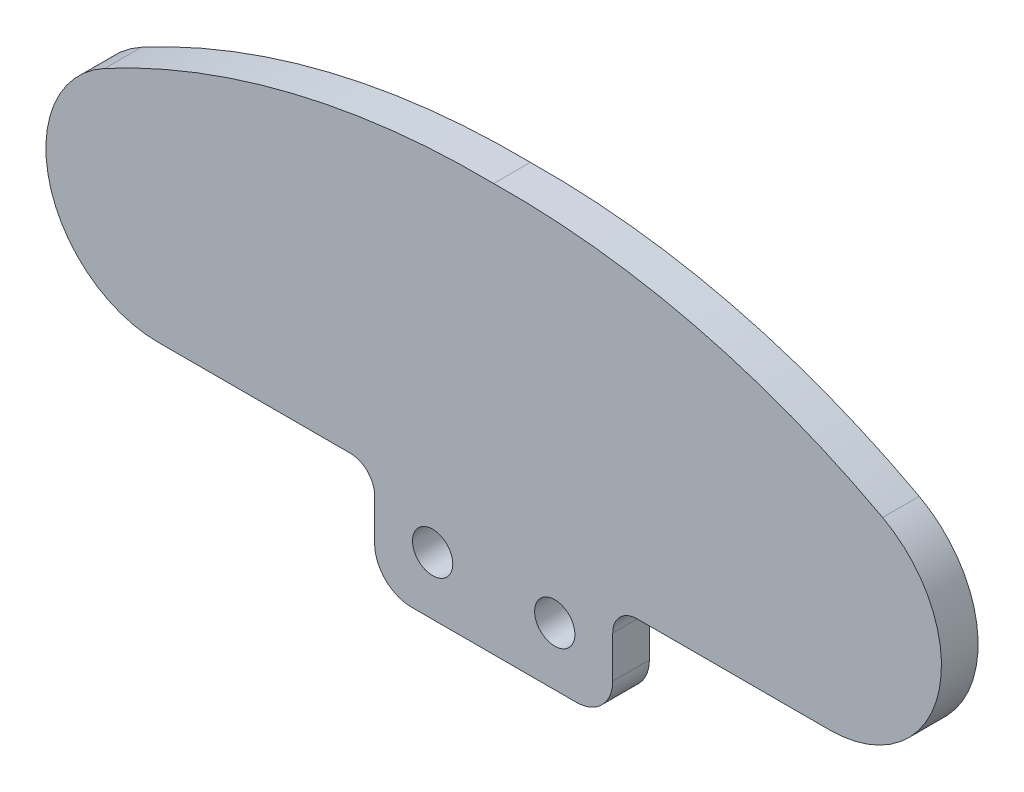
ISO-10303-21;
HEADER;
FILE_DESCRIPTION(('STEP AP214'),'2;1');
FILE_NAME('part.step','',(''),(''),'','','');
FILE_SCHEMA(('AUTOMOTIVE_DESIGN { 1 0 10303 214 1 1 1 1 }'));
ENDSEC;
DATA;
#1=APPLICATION_CONTEXT('core data for automotive mechanical design processes');
#2=APPLICATION_PROTOCOL_DEFINITION('international standard','automotive_design',2000,#1);
#3=PRODUCT_CONTEXT('',#1,'mechanical');
#4=PRODUCT('Part','Part','',(#3));
#5=PRODUCT_RELATED_PRODUCT_CATEGORY('part','',(#4));
#6=PRODUCT_DEFINITION_FORMATION('','',#4);
#7=PRODUCT_DEFINITION_CONTEXT('part definition',#1,'design');
#8=PRODUCT_DEFINITION('design','',#6,#7);
#9=PRODUCT_DEFINITION_SHAPE('','',#8);
#10=(LENGTH_UNIT() NAMED_UNIT(*) SI_UNIT(.MILLI.,.METRE.));
#11=(NAMED_UNIT(*) PLANE_ANGLE_UNIT() SI_UNIT($,.RADIAN.));
#12=(NAMED_UNIT(*) SI_UNIT($,.STERADIAN.) SOLID_ANGLE_UNIT());
#13=UNCERTAINTY_MEASURE_WITH_UNIT(LENGTH_MEASURE(1.E-05),#10,'distance_accuracy_value','');
#14=(GEOMETRIC_REPRESENTATION_CONTEXT(3) GLOBAL_UNCERTAINTY_ASSIGNED_CONTEXT((#13)) GLOBAL_UNIT_ASSIGNED_CONTEXT((#10,
#11,#12)) REPRESENTATION_CONTEXT('',''));
#15=CARTESIAN_POINT('',(0.,0.,0.));
#16=DIRECTION('',(0.,0.,1.));
#17=DIRECTION('',(1.,0.,0.));
#18=AXIS2_PLACEMENT_3D('',#15,#16,#17);
#19=CARTESIAN_POINT('',(175.25,592.824163383124,3.));
#20=DIRECTION('',(0.,0.,-1.));
#21=DIRECTION('',(-1.,0.,0.));
#22=AXIS2_PLACEMENT_3D('',#19,#20,#21);
#23=CYLINDRICAL_SURFACE('',#22,9.16791338312348);
#24=CARTESIAN_POINT('',(175.25,592.824163383124,0.));
#25=DIRECTION('',(0.,0.,1.));
#26=DIRECTION('',(1.,0.,0.));
#27=AXIS2_PLACEMENT_3D('',#24,#25,#26);
#28=CIRCLE('',#27,9.16791338312348);
#29=CARTESIAN_POINT('',(175.25,583.65625,0.));
#30=VERTEX_POINT('',#29);
#31=CARTESIAN_POINT('',(179.599043891456,600.894879152536,0.));
#32=VERTEX_POINT('',#31);
#33=EDGE_CURVE('E193',#30,#32,#28,.T.);
#34=ORIENTED_EDGE('',*,*,#33,.T.);
#35=DIRECTION('',(0.,0.,-1.));
#36=VECTOR('',#35,1.);
#37=CARTESIAN_POINT('',(179.599043891456,600.894879152536,3.));
#38=LINE('',#37,#36);
#39=CARTESIAN_POINT('',(179.599043891456,600.894879152536,3.));
#40=VERTEX_POINT('',#39);
#41=EDGE_CURVE('E135',#40,#32,#38,.T.);
#42=ORIENTED_EDGE('',*,*,#41,.F.);
#43=CARTESIAN_POINT('',(175.25,592.824163383124,3.));
#44=DIRECTION('',(0.,0.,1.));
#45=DIRECTION('',(1.,0.,0.));
#46=AXIS2_PLACEMENT_3D('',#43,#44,#45);
#47=CIRCLE('',#46,9.16791338312348);
#48=CARTESIAN_POINT('',(175.25,583.65625,3.));
#49=VERTEX_POINT('',#48);
#50=EDGE_CURVE('E122',#49,#40,#47,.T.);
#51=ORIENTED_EDGE('',*,*,#50,.F.);
#52=DIRECTION('',(0.,0.,-1.));
#53=VECTOR('',#52,1.);
#54=CARTESIAN_POINT('',(175.25,583.65625,3.));
#55=LINE('',#54,#53);
#56=EDGE_CURVE('E163',#49,#30,#55,.T.);
#57=ORIENTED_EDGE('',*,*,#56,.T.);
#58=EDGE_LOOP('',(#34,#42,#51,#57));
#59=FACE_BOUND('',#58,.T.);
#60=ADVANCED_FACE('F17',(#59),#23,.T.);
#61=CARTESIAN_POINT('',(148.800998393416,543.741565074368,3.));
#62=DIRECTION('',(0.,0.,-1.));
#63=DIRECTION('',(-1.,0.,0.));
#64=AXIS2_PLACEMENT_3D('',#61,#62,#63);
#65=CYLINDRICAL_SURFACE('',#64,64.9231924401213);
#66=CARTESIAN_POINT('',(148.800998393416,543.741565074368,0.));
#67=DIRECTION('',(0.,0.,1.));
#68=DIRECTION('',(1.,0.,0.));
#69=AXIS2_PLACEMENT_3D('',#66,#67,#68);
#70=CIRCLE('',#69,64.9231924401213);
#71=CARTESIAN_POINT('',(147.75,608.65625,0.));
#72=VERTEX_POINT('',#71);
#73=EDGE_CURVE('E132',#32,#72,#70,.T.);
#74=ORIENTED_EDGE('',*,*,#73,.T.);
#75=DIRECTION('',(0.,0.,-1.));
#76=VECTOR('',#75,1.);
#77=CARTESIAN_POINT('',(147.75,608.65625,3.));
#78=LINE('',#77,#76);
#79=CARTESIAN_POINT('',(147.75,608.65625,3.));
#80=VERTEX_POINT('',#79);
#81=EDGE_CURVE('E130',#80,#72,#78,.T.);
#82=ORIENTED_EDGE('',*,*,#81,.F.);
#83=CARTESIAN_POINT('',(148.800998393416,543.741565074368,3.));
#84=DIRECTION('',(0.,0.,1.));
#85=DIRECTION('',(1.,0.,0.));
#86=AXIS2_PLACEMENT_3D('',#83,#84,#85);
#87=CIRCLE('',#86,64.9231924401213);
#88=EDGE_CURVE('E111',#40,#80,#87,.T.);
#89=ORIENTED_EDGE('',*,*,#88,.F.);
#90=ORIENTED_EDGE('',*,*,#41,.T.);
#91=EDGE_LOOP('',(#74,#82,#89,#90));
#92=FACE_BOUND('',#91,.T.);
#93=ADVANCED_FACE('F131',(#92),#65,.T.);
#94=CARTESIAN_POINT('',(146.699001606584,543.741565074369,3.));
#95=DIRECTION('',(0.,0.,-1.));
#96=DIRECTION('',(-1.,0.,0.));
#97=AXIS2_PLACEMENT_3D('',#94,#95,#96);
#98=CYLINDRICAL_SURFACE('',#97,64.9231924401209);
#99=CARTESIAN_POINT('',(146.699001606584,543.741565074369,0.));
#100=DIRECTION('',(0.,0.,1.));
#101=DIRECTION('',(1.,0.,0.));
#102=AXIS2_PLACEMENT_3D('',#99,#100,#101);
#103=CIRCLE('',#102,64.9231924401209);
#104=CARTESIAN_POINT('',(115.900956108544,600.894879152536,0.));
#105=VERTEX_POINT('',#104);
#106=EDGE_CURVE('E183',#72,#105,#103,.T.);
#107=ORIENTED_EDGE('',*,*,#106,.T.);
#108=DIRECTION('',(0.,0.,-1.));
#109=VECTOR('',#108,1.);
#110=CARTESIAN_POINT('',(115.900956108544,600.894879152536,3.));
#111=LINE('',#110,#109);
#112=CARTESIAN_POINT('',(115.900956108544,600.894879152536,3.));
#113=VERTEX_POINT('',#112);
#114=EDGE_CURVE('E136',#113,#105,#111,.T.);
#115=ORIENTED_EDGE('',*,*,#114,.F.);
#116=CARTESIAN_POINT('',(146.699001606584,543.741565074369,3.));
#117=DIRECTION('',(0.,0.,1.));
#118=DIRECTION('',(1.,0.,0.));
#119=AXIS2_PLACEMENT_3D('',#116,#117,#118);
#120=CIRCLE('',#119,64.9231924401209);
#121=EDGE_CURVE('E118',#80,#113,#120,.T.);
#122=ORIENTED_EDGE('',*,*,#121,.F.);
#123=ORIENTED_EDGE('',*,*,#81,.T.);
#124=EDGE_LOOP('',(#107,#115,#122,#123));
#125=FACE_BOUND('',#124,.T.);
#126=ADVANCED_FACE('F138',(#125),#98,.T.);
#127=CARTESIAN_POINT('',(120.25,592.824163383124,3.));
#128=DIRECTION('',(0.,0.,-1.));
#129=DIRECTION('',(-1.,0.,0.));
#130=AXIS2_PLACEMENT_3D('',#127,#128,#129);
#131=CYLINDRICAL_SURFACE('',#130,9.16791338312351);
#132=CARTESIAN_POINT('',(120.25,592.824163383124,0.));
#133=DIRECTION('',(0.,0.,1.));
#134=DIRECTION('',(1.,0.,0.));
#135=AXIS2_PLACEMENT_3D('',#132,#133,#134);
#136=CIRCLE('',#135,9.16791338312351);
#137=CARTESIAN_POINT('',(120.25,583.65625,0.));
#138=VERTEX_POINT('',#137);
#139=EDGE_CURVE('E186',#105,#138,#136,.T.);
#140=ORIENTED_EDGE('',*,*,#139,.T.);
#141=DIRECTION('',(0.,0.,-1.));
#142=VECTOR('',#141,1.);
#143=CARTESIAN_POINT('',(120.25,583.65625,3.));
#144=LINE('',#143,#142);
#145=CARTESIAN_POINT('',(120.25,583.65625,3.));
#146=VERTEX_POINT('',#145);
#147=EDGE_CURVE('E204',#146,#138,#144,.T.);
#148=ORIENTED_EDGE('',*,*,#147,.F.);
#149=CARTESIAN_POINT('',(120.25,592.824163383124,3.));
#150=DIRECTION('',(0.,0.,1.));
#151=DIRECTION('',(1.,0.,0.));
#152=AXIS2_PLACEMENT_3D('',#149,#150,#151);
#153=CIRCLE('',#152,9.16791338312351);
#154=EDGE_CURVE('E142',#113,#146,#153,.T.);
#155=ORIENTED_EDGE('',*,*,#154,.F.);
#156=ORIENTED_EDGE('',*,*,#114,.T.);
#157=EDGE_LOOP('',(#140,#148,#155,#156));
#158=FACE_BOUND('',#157,.T.);
#159=ADVANCED_FACE('F263',(#158),#131,.T.);
#160=CARTESIAN_POINT('',(129.125,583.65625,3.));
#161=DIRECTION('',(0.,-1.,0.));
#162=DIRECTION('',(1.,0.,0.));
#163=AXIS2_PLACEMENT_3D('',#160,#161,#162);
#164=PLANE('',#163);
#165=DIRECTION('',(-1.,0.,0.));
#166=VECTOR('',#165,1.);
#167=CARTESIAN_POINT('',(129.125,583.65625,0.));
#168=LINE('',#167,#166);
#169=CARTESIAN_POINT('',(136.,583.65625,0.));
#170=VERTEX_POINT('',#169);
#171=EDGE_CURVE('E190',#170,#138,#168,.T.);
#172=ORIENTED_EDGE('',*,*,#171,.F.);
#173=DIRECTION('',(0.,0.,-1.));
#174=VECTOR('',#173,1.);
#175=CARTESIAN_POINT('',(136.,583.65625,3.));
#176=LINE('',#175,#174);
#177=CARTESIAN_POINT('',(136.,583.65625,3.));
#178=VERTEX_POINT('',#177);
#179=EDGE_CURVE('E230',#170,#178,#176,.F.);
#180=ORIENTED_EDGE('',*,*,#179,.T.);
#181=DIRECTION('',(-1.,0.,0.));
#182=VECTOR('',#181,1.);
#183=CARTESIAN_POINT('',(129.125,583.65625,3.));
#184=LINE('',#183,#182);
#185=EDGE_CURVE('E149',#178,#146,#184,.T.);
#186=ORIENTED_EDGE('',*,*,#185,.T.);
#187=ORIENTED_EDGE('',*,*,#147,.T.);
#188=EDGE_LOOP('',(#172,#180,#186,#187));
#189=FACE_BOUND('',#188,.T.);
#190=ADVANCED_FACE('F260',(#189),#164,.T.);
#191=CARTESIAN_POINT('',(138.,579.45068782568,3.));
#192=DIRECTION('',(-1.,0.,0.));
#193=DIRECTION('',(0.,0.,1.));
#194=AXIS2_PLACEMENT_3D('',#191,#192,#193);
#195=PLANE('',#194);
#196=DIRECTION('',(0.,1.,0.));
#197=VECTOR('',#196,1.);
#198=CARTESIAN_POINT('',(138.,579.45068782568,3.));
#199=LINE('',#198,#197);
#200=CARTESIAN_POINT('',(138.,578.24512565136,3.));
#201=VERTEX_POINT('',#200);
#202=CARTESIAN_POINT('',(138.,581.65625,3.));
#203=VERTEX_POINT('',#202);
#204=EDGE_CURVE('E202',#201,#203,#199,.T.);
#205=ORIENTED_EDGE('',*,*,#204,.T.);
#206=DIRECTION('',(0.,0.,-1.));
#207=VECTOR('',#206,1.);
#208=CARTESIAN_POINT('',(138.,581.65625,0.));
#209=LINE('',#208,#207);
#210=CARTESIAN_POINT('',(138.,581.65625,0.));
#211=VERTEX_POINT('',#210);
#212=EDGE_CURVE('E227',#203,#211,#209,.T.);
#213=ORIENTED_EDGE('',*,*,#212,.T.);
#214=DIRECTION('',(0.,1.,0.));
#215=VECTOR('',#214,1.);
#216=CARTESIAN_POINT('',(138.,579.45068782568,0.));
#217=LINE('',#216,#215);
#218=CARTESIAN_POINT('',(138.,578.24512565136,0.));
#219=VERTEX_POINT('',#218);
#220=EDGE_CURVE('E164',#219,#211,#217,.T.);
#221=ORIENTED_EDGE('',*,*,#220,.F.);
#222=DIRECTION('',(0.,0.,-1.));
#223=VECTOR('',#222,1.);
#224=CARTESIAN_POINT('',(138.,578.24512565136,3.));
#225=LINE('',#224,#223);
#226=EDGE_CURVE('E218',#219,#201,#225,.F.);
#227=ORIENTED_EDGE('',*,*,#226,.T.);
#228=EDGE_LOOP('',(#205,#213,#221,#227));
#229=FACE_BOUND('',#228,.T.);
#230=ADVANCED_FACE('F247',(#229),#195,.T.);
#231=CARTESIAN_POINT('',(147.75,575.24512565136,3.));
#232=DIRECTION('',(0.,1.,0.));
#233=DIRECTION('',(0.,0.,1.));
#234=AXIS2_PLACEMENT_3D('',#231,#232,#233);
#235=PLANE('',#234);
#236=DIRECTION('',(1.,0.,0.));
#237=VECTOR('',#236,1.);
#238=CARTESIAN_POINT('',(147.75,575.24512565136,3.));
#239=LINE('',#238,#237);
#240=CARTESIAN_POINT('',(141.,575.24512565136,3.));
#241=VERTEX_POINT('',#240);
#242=CARTESIAN_POINT('',(154.5,575.24512565136,3.));
#243=VERTEX_POINT('',#242);
#244=EDGE_CURVE('E251',#241,#243,#239,.T.);
#245=ORIENTED_EDGE('',*,*,#244,.F.);
#246=DIRECTION('',(0.,0.,-1.));
#247=VECTOR('',#246,1.);
#248=CARTESIAN_POINT('',(141.,575.24512565136,0.));
#249=LINE('',#248,#247);
#250=CARTESIAN_POINT('',(141.,575.24512565136,0.));
#251=VERTEX_POINT('',#250);
#252=EDGE_CURVE('E211',#241,#251,#249,.T.);
#253=ORIENTED_EDGE('',*,*,#252,.T.);
#254=DIRECTION('',(1.,0.,0.));
#255=VECTOR('',#254,1.);
#256=CARTESIAN_POINT('',(147.75,575.24512565136,0.));
#257=LINE('',#256,#255);
#258=CARTESIAN_POINT('',(154.5,575.24512565136,0.));
#259=VERTEX_POINT('',#258);
#260=EDGE_CURVE('E168',#251,#259,#257,.T.);
#261=ORIENTED_EDGE('',*,*,#260,.T.);
#262=DIRECTION('',(0.,0.,-1.));
#263=VECTOR('',#262,1.);
#264=CARTESIAN_POINT('',(154.5,575.24512565136,3.));
#265=LINE('',#264,#263);
#266=EDGE_CURVE('E206',#259,#243,#265,.F.);
#267=ORIENTED_EDGE('',*,*,#266,.T.);
#268=EDGE_LOOP('',(#245,#253,#261,#267));
#269=FACE_BOUND('',#268,.T.);
#270=ADVANCED_FACE('F292',(#269),#235,.F.);
#271=CARTESIAN_POINT('',(157.5,579.45068782568,3.));
#272=DIRECTION('',(-1.,0.,0.));
#273=DIRECTION('',(0.,0.,1.));
#274=AXIS2_PLACEMENT_3D('',#271,#272,#273);
#275=PLANE('',#274);
#276=DIRECTION('',(0.,1.,0.));
#277=VECTOR('',#276,1.);
#278=CARTESIAN_POINT('',(157.5,579.45068782568,0.));
#279=LINE('',#278,#277);
#280=CARTESIAN_POINT('',(157.5,578.24512565136,0.));
#281=VERTEX_POINT('',#280);
#282=CARTESIAN_POINT('',(157.5,581.65625,0.));
#283=VERTEX_POINT('',#282);
#284=EDGE_CURVE('E172',#281,#283,#279,.T.);
#285=ORIENTED_EDGE('',*,*,#284,.T.);
#286=DIRECTION('',(0.,0.,-1.));
#287=VECTOR('',#286,1.);
#288=CARTESIAN_POINT('',(157.5,581.65625,3.));
#289=LINE('',#288,#287);
#290=CARTESIAN_POINT('',(157.5,581.65625,3.));
#291=VERTEX_POINT('',#290);
#292=EDGE_CURVE('E38',#283,#291,#289,.F.);
#293=ORIENTED_EDGE('',*,*,#292,.T.);
#294=DIRECTION('',(0.,1.,0.));
#295=VECTOR('',#294,1.);
#296=CARTESIAN_POINT('',(157.5,579.45068782568,3.));
#297=LINE('',#296,#295);
#298=CARTESIAN_POINT('',(157.5,578.24512565136,3.));
#299=VERTEX_POINT('',#298);
#300=EDGE_CURVE('E272',#299,#291,#297,.T.);
#301=ORIENTED_EDGE('',*,*,#300,.F.);
#302=DIRECTION('',(0.,0.,-1.));
#303=VECTOR('',#302,1.);
#304=CARTESIAN_POINT('',(157.5,578.24512565136,3.));
#305=LINE('',#304,#303);
#306=EDGE_CURVE('E224',#299,#281,#305,.T.);
#307=ORIENTED_EDGE('',*,*,#306,.T.);
#308=EDGE_LOOP('',(#285,#293,#301,#307));
#309=FACE_BOUND('',#308,.T.);
#310=ADVANCED_FACE('F291',(#309),#275,.F.);
#311=CARTESIAN_POINT('',(142.75,579.99512565136,3.));
#312=DIRECTION('',(0.,0.,-1.));
#313=DIRECTION('',(-1.,0.,0.));
#314=AXIS2_PLACEMENT_3D('',#311,#312,#313);
#315=CYLINDRICAL_SURFACE('',#314,1.65);
#316=CARTESIAN_POINT('',(142.75,579.99512565136,3.));
#317=DIRECTION('',(0.,0.,1.));
#318=DIRECTION('',(1.,0.,0.));
#319=AXIS2_PLACEMENT_3D('',#316,#317,#318);
#320=CIRCLE('',#319,1.65);
#321=CARTESIAN_POINT('',(144.4,579.99512565136,3.));
#322=VERTEX_POINT('',#321);
#323=EDGE_CURVE('E152',#322,#322,#320,.T.);
#324=ORIENTED_EDGE('',*,*,#323,.T.);
#325=EDGE_LOOP('',(#324));
#326=FACE_BOUND('',#325,.T.);
#327=CARTESIAN_POINT('',(142.75,579.99512565136,0.));
#328=DIRECTION('',(0.,0.,1.));
#329=DIRECTION('',(1.,0.,0.));
#330=AXIS2_PLACEMENT_3D('',#327,#328,#329);
#331=CIRCLE('',#330,1.65);
#332=CARTESIAN_POINT('',(144.4,579.99512565136,0.));
#333=VERTEX_POINT('',#332);
#334=EDGE_CURVE('E175',#333,#333,#331,.T.);
#335=ORIENTED_EDGE('',*,*,#334,.F.);
#336=EDGE_LOOP('',(#335));
#337=FACE_BOUND('',#336,.T.);
#338=ADVANCED_FACE('F325',(#326,#337),#315,.F.);
#339=CARTESIAN_POINT('',(147.75,583.65625,3.));
#340=DIRECTION('',(0.,-1.,0.));
#341=DIRECTION('',(0.,0.,-1.));
#342=AXIS2_PLACEMENT_3D('',#339,#340,#341);
#343=PLANE('',#342);
#344=DIRECTION('',(-1.,0.,0.));
#345=VECTOR('',#344,1.);
#346=CARTESIAN_POINT('',(147.75,583.65625,3.));
#347=LINE('',#346,#345);
#348=CARTESIAN_POINT('',(159.5,583.65625,3.));
#349=VERTEX_POINT('',#348);
#350=EDGE_CURVE('E127',#49,#349,#347,.T.);
#351=ORIENTED_EDGE('',*,*,#350,.T.);
#352=DIRECTION('',(0.,0.,-1.));
#353=VECTOR('',#352,1.);
#354=CARTESIAN_POINT('',(159.5,583.65625,3.));
#355=LINE('',#354,#353);
#356=CARTESIAN_POINT('',(159.5,583.65625,0.));
#357=VERTEX_POINT('',#356);
#358=EDGE_CURVE('E232',#349,#357,#355,.T.);
#359=ORIENTED_EDGE('',*,*,#358,.T.);
#360=DIRECTION('',(-1.,0.,0.));
#361=VECTOR('',#360,1.);
#362=CARTESIAN_POINT('',(147.75,583.65625,0.));
#363=LINE('',#362,#361);
#364=EDGE_CURVE('E199',#30,#357,#363,.T.);
#365=ORIENTED_EDGE('',*,*,#364,.F.);
#366=ORIENTED_EDGE('',*,*,#56,.F.);
#367=EDGE_LOOP('',(#351,#359,#365,#366));
#368=FACE_BOUND('',#367,.T.);
#369=ADVANCED_FACE('F268',(#368),#343,.T.);
#370=CARTESIAN_POINT('',(152.75,579.99512565136,3.));
#371=DIRECTION('',(0.,0.,-1.));
#372=DIRECTION('',(-1.,0.,0.));
#373=AXIS2_PLACEMENT_3D('',#370,#371,#372);
#374=CYLINDRICAL_SURFACE('',#373,1.65);
#375=CARTESIAN_POINT('',(152.75,579.99512565136,3.));
#376=DIRECTION('',(0.,0.,1.));
#377=DIRECTION('',(1.,0.,0.));
#378=AXIS2_PLACEMENT_3D('',#375,#376,#377);
#379=CIRCLE('',#378,1.65);
#380=CARTESIAN_POINT('',(154.4,579.99512565136,3.));
#381=VERTEX_POINT('',#380);
#382=EDGE_CURVE('E143',#381,#381,#379,.T.);
#383=ORIENTED_EDGE('',*,*,#382,.T.);
#384=EDGE_LOOP('',(#383));
#385=FACE_BOUND('',#384,.T.);
#386=CARTESIAN_POINT('',(152.75,579.99512565136,0.));
#387=DIRECTION('',(0.,0.,1.));
#388=DIRECTION('',(1.,0.,0.));
#389=AXIS2_PLACEMENT_3D('',#386,#387,#388);
#390=CIRCLE('',#389,1.65);
#391=CARTESIAN_POINT('',(154.4,579.99512565136,0.));
#392=VERTEX_POINT('',#391);
#393=EDGE_CURVE('E179',#392,#392,#390,.T.);
#394=ORIENTED_EDGE('',*,*,#393,.F.);
#395=EDGE_LOOP('',(#394));
#396=FACE_BOUND('',#395,.T.);
#397=ADVANCED_FACE('F321',(#385,#396),#374,.F.);
#398=CARTESIAN_POINT('',(56.,361.,3.));
#399=DIRECTION('',(0.,0.,1.));
#400=DIRECTION('',(1.,0.,0.));
#401=AXIS2_PLACEMENT_3D('',#398,#399,#400);
#402=PLANE('',#401);
#403=ORIENTED_EDGE('',*,*,#204,.F.);
#404=CARTESIAN_POINT('',(141.,578.24512565136,3.));
#405=DIRECTION('',(0.,0.,1.));
#406=DIRECTION('',(1.,0.,0.));
#407=AXIS2_PLACEMENT_3D('',#404,#405,#406);
#408=CIRCLE('',#407,3.);
#409=EDGE_CURVE('E222',#201,#241,#408,.T.);
#410=ORIENTED_EDGE('',*,*,#409,.T.);
#411=ORIENTED_EDGE('',*,*,#244,.T.);
#412=CARTESIAN_POINT('',(154.5,578.24512565136,3.));
#413=DIRECTION('',(0.,0.,1.));
#414=DIRECTION('',(1.,0.,0.));
#415=AXIS2_PLACEMENT_3D('',#412,#413,#414);
#416=CIRCLE('',#415,3.);
#417=EDGE_CURVE('E220',#243,#299,#416,.T.);
#418=ORIENTED_EDGE('',*,*,#417,.T.);
#419=ORIENTED_EDGE('',*,*,#300,.T.);
#420=CARTESIAN_POINT('',(159.5,581.65625,3.));
#421=DIRECTION('',(0.,0.,1.));
#422=DIRECTION('',(1.,0.,0.));
#423=AXIS2_PLACEMENT_3D('',#420,#421,#422);
#424=CIRCLE('',#423,2.);
#425=EDGE_CURVE('E11',#291,#349,#424,.F.);
#426=ORIENTED_EDGE('',*,*,#425,.T.);
#427=ORIENTED_EDGE('',*,*,#350,.F.);
#428=ORIENTED_EDGE('',*,*,#50,.T.);
#429=ORIENTED_EDGE('',*,*,#88,.T.);
#430=ORIENTED_EDGE('',*,*,#121,.T.);
#431=ORIENTED_EDGE('',*,*,#154,.T.);
#432=ORIENTED_EDGE('',*,*,#185,.F.);
#433=CARTESIAN_POINT('',(136.,581.65625,3.));
#434=DIRECTION('',(0.,0.,1.));
#435=DIRECTION('',(1.,0.,0.));
#436=AXIS2_PLACEMENT_3D('',#433,#434,#435);
#437=CIRCLE('',#436,2.);
#438=EDGE_CURVE('E238',#178,#203,#437,.F.);
#439=ORIENTED_EDGE('',*,*,#438,.T.);
#440=EDGE_LOOP('',(#403,#410,#411,#418,#419,#426,#427,#428,#429,#430,#431,#432,#439));
#441=FACE_BOUND('',#440,.T.);
#442=ORIENTED_EDGE('',*,*,#323,.F.);
#443=EDGE_LOOP('',(#442));
#444=FACE_BOUND('',#443,.T.);
#445=ORIENTED_EDGE('',*,*,#382,.F.);
#446=EDGE_LOOP('',(#445));
#447=FACE_BOUND('',#446,.T.);
#448=ADVANCED_FACE('F114',(#441,#444,#447),#402,.T.);
#449=CARTESIAN_POINT('',(56.,361.,0.));
#450=DIRECTION('',(0.,0.,1.));
#451=DIRECTION('',(1.,0.,0.));
#452=AXIS2_PLACEMENT_3D('',#449,#450,#451);
#453=PLANE('',#452);
#454=ORIENTED_EDGE('',*,*,#260,.F.);
#455=CARTESIAN_POINT('',(141.,578.24512565136,0.));
#456=DIRECTION('',(0.,0.,1.));
#457=DIRECTION('',(1.,0.,0.));
#458=AXIS2_PLACEMENT_3D('',#455,#456,#457);
#459=CIRCLE('',#458,3.);
#460=EDGE_CURVE('E216',#251,#219,#459,.F.);
#461=ORIENTED_EDGE('',*,*,#460,.T.);
#462=ORIENTED_EDGE('',*,*,#220,.T.);
#463=CARTESIAN_POINT('',(136.,581.65625,0.));
#464=DIRECTION('',(0.,0.,1.));
#465=DIRECTION('',(1.,0.,0.));
#466=AXIS2_PLACEMENT_3D('',#463,#464,#465);
#467=CIRCLE('',#466,2.);
#468=EDGE_CURVE('E236',#211,#170,#467,.T.);
#469=ORIENTED_EDGE('',*,*,#468,.T.);
#470=ORIENTED_EDGE('',*,*,#171,.T.);
#471=ORIENTED_EDGE('',*,*,#139,.F.);
#472=ORIENTED_EDGE('',*,*,#106,.F.);
#473=ORIENTED_EDGE('',*,*,#73,.F.);
#474=ORIENTED_EDGE('',*,*,#33,.F.);
#475=ORIENTED_EDGE('',*,*,#364,.T.);
#476=CARTESIAN_POINT('',(159.5,581.65625,0.));
#477=DIRECTION('',(0.,0.,1.));
#478=DIRECTION('',(1.,0.,0.));
#479=AXIS2_PLACEMENT_3D('',#476,#477,#478);
#480=CIRCLE('',#479,2.);
#481=EDGE_CURVE('E25',#357,#283,#480,.T.);
#482=ORIENTED_EDGE('',*,*,#481,.T.);
#483=ORIENTED_EDGE('',*,*,#284,.F.);
#484=CARTESIAN_POINT('',(154.5,578.24512565136,0.));
#485=DIRECTION('',(0.,0.,1.));
#486=DIRECTION('',(1.,0.,0.));
#487=AXIS2_PLACEMENT_3D('',#484,#485,#486);
#488=CIRCLE('',#487,3.);
#489=EDGE_CURVE('E214',#281,#259,#488,.F.);
#490=ORIENTED_EDGE('',*,*,#489,.T.);
#491=EDGE_LOOP('',(#454,#461,#462,#469,#470,#471,#472,#473,#474,#475,#482,#483,#490));
#492=FACE_BOUND('',#491,.T.);
#493=ORIENTED_EDGE('',*,*,#334,.T.);
#494=EDGE_LOOP('',(#493));
#495=FACE_BOUND('',#494,.T.);
#496=ORIENTED_EDGE('',*,*,#393,.T.);
#497=EDGE_LOOP('',(#496));
#498=FACE_BOUND('',#497,.T.);
#499=ADVANCED_FACE('F256',(#492,#495,#498),#453,.F.);
#500=CARTESIAN_POINT('',(141.,578.24512565136,3.));
#501=DIRECTION('',(0.,0.,1.));
#502=DIRECTION('',(1.,0.,0.));
#503=AXIS2_PLACEMENT_3D('',#500,#501,#502);
#504=CYLINDRICAL_SURFACE('',#503,3.);
#505=ORIENTED_EDGE('',*,*,#409,.F.);
#506=ORIENTED_EDGE('',*,*,#226,.F.);
#507=ORIENTED_EDGE('',*,*,#460,.F.);
#508=ORIENTED_EDGE('',*,*,#252,.F.);
#509=EDGE_LOOP('',(#505,#506,#507,#508));
#510=FACE_BOUND('',#509,.T.);
#511=ADVANCED_FACE('F294',(#510),#504,.T.);
#512=CARTESIAN_POINT('',(154.5,578.24512565136,3.));
#513=DIRECTION('',(0.,0.,-1.));
#514=DIRECTION('',(-1.,0.,0.));
#515=AXIS2_PLACEMENT_3D('',#512,#513,#514);
#516=CYLINDRICAL_SURFACE('',#515,3.);
#517=ORIENTED_EDGE('',*,*,#417,.F.);
#518=ORIENTED_EDGE('',*,*,#266,.F.);
#519=ORIENTED_EDGE('',*,*,#489,.F.);
#520=ORIENTED_EDGE('',*,*,#306,.F.);
#521=EDGE_LOOP('',(#517,#518,#519,#520));
#522=FACE_BOUND('',#521,.T.);
#523=ADVANCED_FACE('F290',(#522),#516,.T.);
#524=CARTESIAN_POINT('',(136.,581.65625,3.));
#525=DIRECTION('',(0.,0.,1.));
#526=DIRECTION('',(1.,0.,0.));
#527=AXIS2_PLACEMENT_3D('',#524,#525,#526);
#528=CYLINDRICAL_SURFACE('',#527,2.);
#529=ORIENTED_EDGE('',*,*,#438,.F.);
#530=ORIENTED_EDGE('',*,*,#179,.F.);
#531=ORIENTED_EDGE('',*,*,#468,.F.);
#532=ORIENTED_EDGE('',*,*,#212,.F.);
#533=EDGE_LOOP('',(#529,#530,#531,#532));
#534=FACE_BOUND('',#533,.T.);
#535=ADVANCED_FACE('F253',(#534),#528,.F.);
#536=CARTESIAN_POINT('',(159.5,581.65625,3.));
#537=DIRECTION('',(0.,0.,-1.));
#538=DIRECTION('',(-1.,0.,0.));
#539=AXIS2_PLACEMENT_3D('',#536,#537,#538);
#540=CYLINDRICAL_SURFACE('',#539,2.);
#541=ORIENTED_EDGE('',*,*,#425,.F.);
#542=ORIENTED_EDGE('',*,*,#292,.F.);
#543=ORIENTED_EDGE('',*,*,#481,.F.);
#544=ORIENTED_EDGE('',*,*,#358,.F.);
#545=EDGE_LOOP('',(#541,#542,#543,#544));
#546=FACE_BOUND('',#545,.T.);
#547=ADVANCED_FACE('F19',(#546),#540,.F.);
#548=CLOSED_SHELL('',(#60,#93,#126,#159,#190,#230,#270,#310,#338,#369,#397,#448,#499,#511,#523,
#535,#547));
#549=MANIFOLD_SOLID_BREP('B1',#548);
#550=ADVANCED_BREP_SHAPE_REPRESENTATION('',(#18,#549),#14);
#551=SHAPE_DEFINITION_REPRESENTATION(#9,#550);
ENDSEC;
END-ISO-10303-21;
